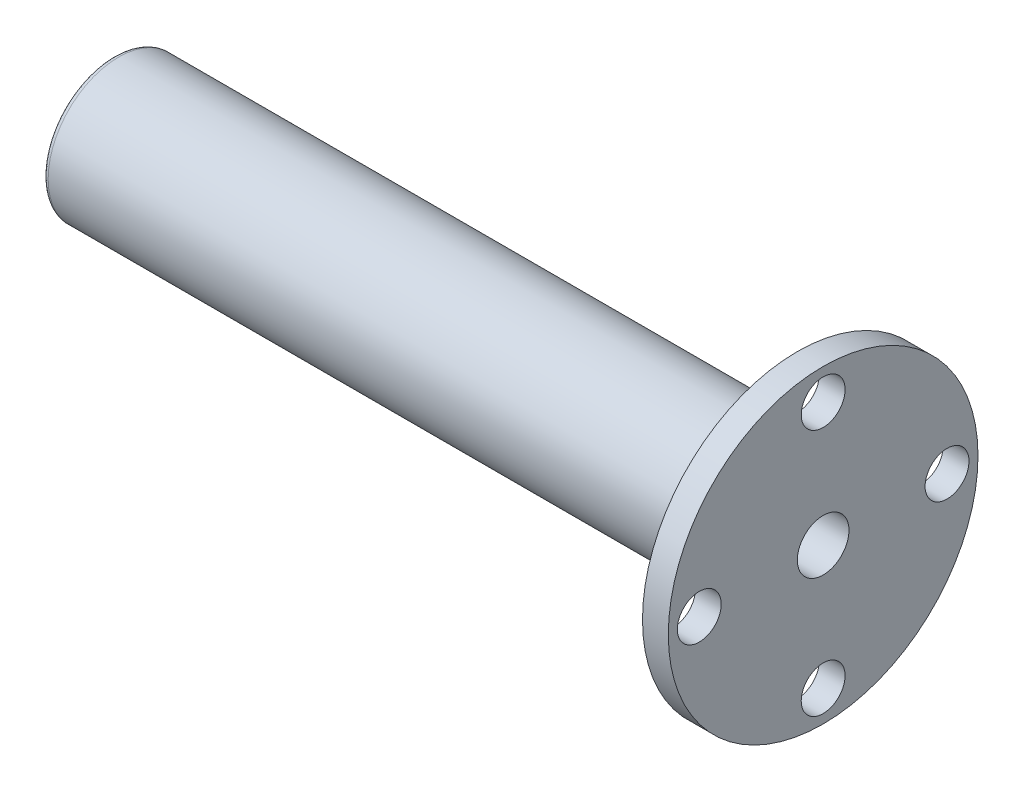
ISO-10303-21;
HEADER;
FILE_DESCRIPTION(('STEP AP214'),'2;1');
FILE_NAME('part.step','',(''),(''),'','','');
FILE_SCHEMA(('AUTOMOTIVE_DESIGN { 1 0 10303 214 1 1 1 1 }'));
ENDSEC;
DATA;
#1=APPLICATION_CONTEXT('core data for automotive mechanical design processes');
#2=APPLICATION_PROTOCOL_DEFINITION('international standard','automotive_design',2000,#1);
#3=PRODUCT_CONTEXT('',#1,'mechanical');
#4=PRODUCT('Part','Part','',(#3));
#5=PRODUCT_RELATED_PRODUCT_CATEGORY('part','',(#4));
#6=PRODUCT_DEFINITION_FORMATION('','',#4);
#7=PRODUCT_DEFINITION_CONTEXT('part definition',#1,'design');
#8=PRODUCT_DEFINITION('design','',#6,#7);
#9=PRODUCT_DEFINITION_SHAPE('','',#8);
#10=(LENGTH_UNIT() NAMED_UNIT(*) SI_UNIT(.MILLI.,.METRE.));
#11=(NAMED_UNIT(*) PLANE_ANGLE_UNIT() SI_UNIT($,.RADIAN.));
#12=(NAMED_UNIT(*) SI_UNIT($,.STERADIAN.) SOLID_ANGLE_UNIT());
#13=UNCERTAINTY_MEASURE_WITH_UNIT(LENGTH_MEASURE(1.E-05),#10,'distance_accuracy_value','');
#14=(GEOMETRIC_REPRESENTATION_CONTEXT(3) GLOBAL_UNCERTAINTY_ASSIGNED_CONTEXT((#13)) GLOBAL_UNIT_ASSIGNED_CONTEXT((#10,
#11,#12)) REPRESENTATION_CONTEXT('',''));
#15=CARTESIAN_POINT('',(0.,0.,0.));
#16=DIRECTION('',(0.,0.,1.));
#17=DIRECTION('',(1.,0.,0.));
#18=AXIS2_PLACEMENT_3D('',#15,#16,#17);
#19=CARTESIAN_POINT('',(-75.0544013863023,0.,0.));
#20=DIRECTION('',(-1.,0.,0.));
#21=DIRECTION('',(0.,0.,1.));
#22=AXIS2_PLACEMENT_3D('',#19,#20,#21);
#23=CYLINDRICAL_SURFACE('',#22,27.3);
#24=CARTESIAN_POINT('',(-73.0544013863023,0.,0.));
#25=DIRECTION('',(1.,0.,0.));
#26=DIRECTION('',(0.,0.,-1.));
#27=AXIS2_PLACEMENT_3D('',#24,#25,#26);
#28=CIRCLE('',#27,27.3);
#29=CARTESIAN_POINT('',(-73.0544013863023,0.,-27.3));
#30=VERTEX_POINT('',#29);
#31=EDGE_CURVE('E141',#30,#30,#28,.T.);
#32=ORIENTED_EDGE('',*,*,#31,.T.);
#33=EDGE_LOOP('',(#32));
#34=FACE_BOUND('',#33,.T.);
#35=CARTESIAN_POINT('',(189.945598613698,0.,0.));
#36=DIRECTION('',(-1.,0.,0.));
#37=DIRECTION('',(0.,0.,1.));
#38=AXIS2_PLACEMENT_3D('',#35,#36,#37);
#39=CIRCLE('',#38,27.3);
#40=CARTESIAN_POINT('',(189.945598613698,0.,27.3));
#41=VERTEX_POINT('',#40);
#42=EDGE_CURVE('E145',#41,#41,#39,.T.);
#43=ORIENTED_EDGE('',*,*,#42,.T.);
#44=EDGE_LOOP('',(#43));
#45=FACE_BOUND('',#44,.T.);
#46=CARTESIAN_POINT('',(59.4455986136977,-26.8382190169169,-5.));
#47=CARTESIAN_POINT('',(59.5848025792468,-26.8382177970626,-5.0000024378322));
#48=CARTESIAN_POINT('',(59.7239748181258,-26.8393041105939,-4.99418500173786));
#49=CARTESIAN_POINT('',(60.0013584689402,-26.8436148019896,-4.97096512411281));
#50=CARTESIAN_POINT('',(60.1395696988901,-26.8468395742379,-4.95356054562736));
#51=CARTESIAN_POINT('',(60.4140724517057,-26.8553365744693,-4.90728510211597));
#52=CARTESIAN_POINT('',(60.5503628135454,-26.8606099899744,-4.87840758643663));
#53=CARTESIAN_POINT('',(60.8200292035603,-26.8730517762385,-4.80939883176183));
#54=CARTESIAN_POINT('',(60.9534041409213,-26.8802208435533,-4.76926345574473));
#55=CARTESIAN_POINT('',(61.2160814409137,-26.8962347342738,-4.67810789799728));
#56=CARTESIAN_POINT('',(61.3453888483589,-26.9050773780515,-4.62710186319117));
#57=CARTESIAN_POINT('',(61.5992691709511,-26.9241948108778,-4.51453123003355));
#58=CARTESIAN_POINT('',(61.7238403195961,-26.9344701277352,-4.45296273844899));
#59=CARTESIAN_POINT('',(61.9672955193632,-26.9561543878969,-4.3197557301476));
#60=CARTESIAN_POINT('',(62.0861822162916,-26.9675627960473,-4.24812196064901));
#61=CARTESIAN_POINT('',(62.3175784784568,-26.9912025343333,-4.09523731612617));
#62=CARTESIAN_POINT('',(62.4300856444771,-27.0034341703361,-4.01398285796323));
#63=CARTESIAN_POINT('',(62.649047628831,-27.0285059319882,-3.84155337566043));
#64=CARTESIAN_POINT('',(62.7554283454366,-27.041351020036,-3.75028496084446));
#65=CARTESIAN_POINT('',(62.960184757601,-27.0671755912223,-3.55911637983718));
#66=CARTESIAN_POINT('',(63.0585574732193,-27.0801551223829,-3.45921302866405));
#67=CARTESIAN_POINT('',(63.2465542193582,-27.1058774666403,-3.251515121464));
#68=CARTESIAN_POINT('',(63.3361808828105,-27.118620350037,-3.14372295751016));
#69=CARTESIAN_POINT('',(63.506130357275,-27.143523120718,-2.92091107597553));
#70=CARTESIAN_POINT('',(63.5864497268785,-27.1556827913893,-2.80588870909218));
#71=CARTESIAN_POINT('',(63.7377006531204,-27.1791559271309,-2.56861610916354));
#72=CARTESIAN_POINT('',(63.8085635267716,-27.190462966435,-2.44632143542423));
#73=CARTESIAN_POINT('',(63.9397476939645,-27.2118207015395,-2.19604129430427));
#74=CARTESIAN_POINT('',(64.0000650420539,-27.2218709267228,-2.06805371937825));
#75=CARTESIAN_POINT('',(64.1096484828472,-27.2404191715908,-1.80737622923463));
#76=CARTESIAN_POINT('',(64.158919338296,-27.2489178599329,-1.67468836925199));
#77=CARTESIAN_POINT('',(64.2460768152893,-27.2641298445177,-1.40551130257619));
#78=CARTESIAN_POINT('',(64.283959289769,-27.2708424902731,-1.26902073085192));
#79=CARTESIAN_POINT('',(64.3792728229546,-27.2878553204478,-0.858480256945966));
#80=CARTESIAN_POINT('',(64.4197177864629,-27.2952662097628,-0.58014171600104));
#81=CARTESIAN_POINT('',(64.4534131431123,-27.3014278332886,-0.0206906631196302));
#82=CARTESIAN_POINT('',(64.4466673783722,-27.3001792725243,0.260421621126622));
#83=CARTESIAN_POINT('',(64.3866352501113,-27.2892469859458,0.814079337656359));
#84=CARTESIAN_POINT('',(64.3339061022822,-27.2796642553679,1.08668700393259));
#85=CARTESIAN_POINT('',(64.1842675251584,-27.2532494263621,1.61910777669911));
#86=CARTESIAN_POINT('',(64.0873565409742,-27.2364170727997,1.87892043253856));
#87=CARTESIAN_POINT('',(63.8515737010913,-27.1972257683891,2.38001482557585));
#88=CARTESIAN_POINT('',(63.7124775498109,-27.1748373951457,2.62118864176665));
#89=CARTESIAN_POINT('',(63.3964366583718,-27.1270122272265,3.0769801541829));
#90=CARTESIAN_POINT('',(63.2194882393959,-27.1015751363552,3.29159526599676));
#91=CARTESIAN_POINT('',(62.8296901644077,-27.0500332348173,3.69147867634295));
#92=CARTESIAN_POINT('',(62.6163529653486,-27.0239241003394,3.87627148503596));
#93=CARTESIAN_POINT('',(62.161461230043,-26.9743375326008,4.20752345744654));
#94=CARTESIAN_POINT('',(61.9199063175149,-26.9508601344425,4.353982109896));
#95=CARTESIAN_POINT('',(61.4148229031659,-26.9091897792839,4.60453470835017));
#96=CARTESIAN_POINT('',(61.1512606808253,-26.8910051306121,4.70856214932108));
#97=CARTESIAN_POINT('',(60.6099921159309,-26.8621084455278,4.87072702227421));
#98=CARTESIAN_POINT('',(60.332287300425,-26.851395604174,4.92886939756505));
#99=CARTESIAN_POINT('',(59.7748970351743,-26.838814006549,4.99692486604674));
#100=CARTESIAN_POINT('',(59.4952975907839,-26.8368202029872,5.00751993478122));
#101=CARTESIAN_POINT('',(58.938323925033,-26.841568144017,4.98200580314926));
#102=CARTESIAN_POINT('',(58.6609495995578,-26.8483094774593,4.94589880097734));
#103=CARTESIAN_POINT('',(58.1185252639528,-26.8696518378582,4.82859009613217));
#104=CARTESIAN_POINT('',(57.8533957707069,-26.8841909208478,4.74774363709599));
#105=CARTESIAN_POINT('',(57.3404464013099,-26.9194375301345,4.54362685365617));
#106=CARTESIAN_POINT('',(57.092627751108,-26.9401454927643,4.42035352825002));
#107=CARTESIAN_POINT('',(56.6183235652446,-26.9856826345608,4.13330426276875));
#108=CARTESIAN_POINT('',(56.3921037831267,-27.0105547923338,3.96909615428532));
#109=CARTESIAN_POINT('',(55.9701834501978,-27.0614958968079,3.60542259551839));
#110=CARTESIAN_POINT('',(55.7744855147894,-27.0875649458226,3.40595412691249));
#111=CARTESIAN_POINT('',(55.4166284280233,-27.1383631290945,2.97438518979902));
#112=CARTESIAN_POINT('',(55.2549271003077,-27.1630710252775,2.74190224029854));
#113=CARTESIAN_POINT('',(54.9728803487285,-27.2080088102487,2.25266256060173));
#114=CARTESIAN_POINT('',(54.8525333847993,-27.2282388657846,1.99590673479862));
#115=CARTESIAN_POINT('',(54.6572983915791,-27.2618521404341,1.46674887631915));
#116=CARTESIAN_POINT('',(54.582182347306,-27.2752696478342,1.19443303044741));
#117=CARTESIAN_POINT('',(54.478828811233,-27.2938842596134,0.640626063806048));
#118=CARTESIAN_POINT('',(54.4505866229477,-27.2990821875437,0.359135865134702));
#119=CARTESIAN_POINT('',(54.444036796155,-27.3002881567405,-0.0613149783921909));
#120=CARTESIAN_POINT('',(54.4476768842029,-27.2996184435085,-0.200214300905928));
#121=CARTESIAN_POINT('',(54.4664905104321,-27.2961792364161,-0.477189377645113));
#122=CARTESIAN_POINT('',(54.4816596972122,-27.2934105347732,-0.615265422786974));
#123=CARTESIAN_POINT('',(54.5234261676011,-27.2858455785434,-0.889660534548435));
#124=CARTESIAN_POINT('',(54.5500274643911,-27.2810486119544,-1.02597896684234));
#125=CARTESIAN_POINT('',(54.6144387631318,-27.2695636297487,-1.29581001173494));
#126=CARTESIAN_POINT('',(54.6522447421154,-27.2628762928967,-1.42932361299607));
#127=CARTESIAN_POINT('',(54.7387281585388,-27.247803965653,-1.69249280841468));
#128=CARTESIAN_POINT('',(54.7873917179064,-27.2394211436843,-1.82215309021539));
#129=CARTESIAN_POINT('',(54.8952386426316,-27.2211857546984,-2.07685912585402));
#130=CARTESIAN_POINT('',(54.9544182575974,-27.2113337118571,-2.20190650567714));
#131=CARTESIAN_POINT('',(55.0829091525584,-27.1904218734761,-2.4466404998651));
#132=CARTESIAN_POINT('',(55.1522244910863,-27.1793615945869,-2.5663249416115));
#133=CARTESIAN_POINT('',(55.3004563214873,-27.1563408420395,-2.79944068118229));
#134=CARTESIAN_POINT('',(55.3793694716733,-27.1443806822444,-2.9128741355496));
#135=CARTESIAN_POINT('',(55.5474511927181,-27.1197077442138,-3.13433263487515));
#136=CARTESIAN_POINT('',(55.6367484362861,-27.1069867442782,-3.24225912662751));
#137=CARTESIAN_POINT('',(55.8240298129179,-27.0813065134862,-3.45018988779972));
#138=CARTESIAN_POINT('',(55.9220108561996,-27.0683473686548,-3.55019695123935));
#139=CARTESIAN_POINT('',(56.1260811381645,-27.0425396064452,-3.74171025993284));
#140=CARTESIAN_POINT('',(56.2321751931972,-27.0296910598391,-3.83321138303588));
#141=CARTESIAN_POINT('',(56.4516602119708,-27.0044772116343,-4.00698371724213));
#142=CARTESIAN_POINT('',(56.565048475024,-26.9921117338735,-4.08925831387571));
#143=CARTESIAN_POINT('',(56.7994596020698,-26.9680985317082,-4.24475084512979));
#144=CARTESIAN_POINT('',(56.9205428892281,-26.9564584201594,-4.3178789095735));
#145=CARTESIAN_POINT('',(57.168506019313,-26.9343629548725,-4.453630169573));
#146=CARTESIAN_POINT('',(57.2953837058715,-26.9239071653535,-4.51625723315873));
#147=CARTESIAN_POINT('',(57.5540059220525,-26.9044887670167,-4.63053408090751));
#148=CARTESIAN_POINT('',(57.6857471927738,-26.8955251797473,-4.68219106443534));
#149=CARTESIAN_POINT('',(57.9531868530873,-26.8793501414454,-4.77417103706977));
#150=CARTESIAN_POINT('',(58.0888844255958,-26.8721383314544,-4.81449634842751));
#151=CARTESIAN_POINT('',(58.4250728018721,-26.8568810423614,-4.8990384566312));
#152=CARTESIAN_POINT('',(58.6272599643177,-26.8499190109916,-4.93685081446956));
#153=CARTESIAN_POINT('',(59.0348540207047,-26.8405889554909,-4.98732947326638));
#154=CARTESIAN_POINT('',(59.2402608338804,-26.8382208163066,-4.99999640398857));
#155=CARTESIAN_POINT('',(59.4455986136977,-26.8382190169169,-5.));
#156=B_SPLINE_CURVE_WITH_KNOTS('',3,(#46,#47,#48,#49,#50,#51,#52,#53,#54,#55,#56,#57,#58,#59,
#60,#61,#62,#63,#64,#65,#66,#67,#68,#69,#70,#71,#72,#73,#74,#75,#76,#77,#78,#79,#80,#81,#82,#83,
#84,#85,#86,#87,#88,#89,#90,#91,#92,#93,#94,#95,#96,#97,#98,#99,#100,#101,#102,#103,#104,#105,
#106,#107,#108,#109,#110,#111,#112,#113,#114,#115,#116,#117,#118,#119,#120,#121,#122,#123,#124,
#125,#126,#127,#128,#129,#130,#131,#132,#133,#134,#135,#136,#137,#138,#139,#140,#141,#142,#143,
#144,#145,#146,#147,#148,#149,#150,#151,#152,#153,#154,#155),.UNSPECIFIED.,.T.,.F.,(4,2,2,2,2,2,
2,2,2,2,2,2,2,2,2,2,2,2,2,2,2,2,2,2,2,2,2,2,2,2,2,2,2,2,2,2,2,2,2,2,2,2,2,2,2,2,2,2,2,2,2,2,2,2,
4),(0.,0.417431625696767,0.834940257411033,1.2526912652538,1.67059598918417,2.08796014286286,
2.50547846529665,2.92280052501638,3.34027850439555,3.7620478587931,4.18397345147147,
4.60577163229757,5.02772528035505,5.45259374794326,5.8776208351848,6.30246431616432,
6.72746231649552,7.56709876669033,8.40666685715577,9.23620045100729,10.0657632408528,
10.8998164729607,11.7339508025745,12.580293443605,13.4266473718527,14.2743227915773,
15.121906876716,15.9572943026427,16.7926424096011,17.6214508669065,18.4503179608219,
19.2883367191858,20.1264272475694,20.9751684235411,21.8238779883657,22.6682724763693,
23.5125823558914,23.9290220007766,24.3453045478092,24.7617333481339,25.1780128132121,
25.5937632108048,26.0093656338123,26.4251349298065,26.8407598788519,27.2622327213363,
27.6835561970851,28.1051317659417,28.5265521345213,28.951833026964,29.3769569219657,
29.8018009515968,30.2265578524065,30.8423206986454,31.458068122995),.UNSPECIFIED.);
#157=CARTESIAN_POINT('',(59.4455986136977,-26.8382190169169,-5.));
#158=VERTEX_POINT('',#157);
#159=EDGE_CURVE('E76',#158,#158,#156,.T.);
#160=ORIENTED_EDGE('',*,*,#159,.F.);
#161=EDGE_LOOP('',(#160));
#162=FACE_BOUND('',#161,.T.);
#163=ADVANCED_FACE('F38',(#34,#45,#162),#23,.T.);
#164=CARTESIAN_POINT('',(61.3455986136977,0.,0.));
#165=DIRECTION('',(1.,0.,0.));
#166=DIRECTION('',(0.,0.,-1.));
#167=AXIS2_PLACEMENT_3D('',#164,#165,#166);
#168=CYLINDRICAL_SURFACE('',#167,5.);
#169=CARTESIAN_POINT('',(174.945598613698,0.,0.));
#170=DIRECTION('',(1.,0.,0.));
#171=DIRECTION('',(0.,0.,-1.));
#172=AXIS2_PLACEMENT_3D('',#169,#170,#171);
#173=CIRCLE('',#172,5.);
#174=CARTESIAN_POINT('',(174.945598613698,0.,-5.));
#175=VERTEX_POINT('',#174);
#176=EDGE_CURVE('E87',#175,#175,#173,.T.);
#177=ORIENTED_EDGE('',*,*,#176,.T.);
#178=EDGE_LOOP('',(#177));
#179=FACE_BOUND('',#178,.T.);
#180=CARTESIAN_POINT('',(59.4455986136977,0.,0.));
#181=DIRECTION('',(0.707106781186547,-0.707106781186547,0.));
#182=DIRECTION('',(0.707106781186547,0.707106781186547,0.));
#183=AXIS2_PLACEMENT_3D('',#180,#181,#182);
#184=ELLIPSE('',#183,7.07106781186547,5.);
#185=CARTESIAN_POINT('',(61.3455986136977,1.90000000000001,-4.62493243193887));
#186=VERTEX_POINT('',#185);
#187=CARTESIAN_POINT('',(64.4455986136977,5.,0.));
#188=VERTEX_POINT('',#187);
#189=EDGE_CURVE('E67',#186,#188,#184,.T.);
#190=ORIENTED_EDGE('',*,*,#189,.F.);
#191=CARTESIAN_POINT('',(61.3455986136977,0.,0.));
#192=DIRECTION('',(1.,0.,0.));
#193=DIRECTION('',(0.,0.,-1.));
#194=AXIS2_PLACEMENT_3D('',#191,#192,#193);
#195=CIRCLE('',#194,5.);
#196=CARTESIAN_POINT('',(61.3455986136977,-1.90000000000001,-4.62493243193887));
#197=VERTEX_POINT('',#196);
#198=EDGE_CURVE('E88',#197,#186,#195,.T.);
#199=ORIENTED_EDGE('',*,*,#198,.F.);
#200=CARTESIAN_POINT('',(59.4455986136977,0.,0.));
#201=DIRECTION('',(0.707106781186547,0.707106781186547,0.));
#202=DIRECTION('',(0.707106781186547,-0.707106781186547,0.));
#203=AXIS2_PLACEMENT_3D('',#200,#201,#202);
#204=ELLIPSE('',#203,7.07106781186547,5.);
#205=CARTESIAN_POINT('',(61.3455986136977,-1.90000000000001,4.62493243193887));
#206=VERTEX_POINT('',#205);
#207=EDGE_CURVE('E53',#206,#197,#204,.T.);
#208=ORIENTED_EDGE('',*,*,#207,.F.);
#209=CARTESIAN_POINT('',(61.3455986136977,1.90000000000001,4.62493243193887));
#210=VERTEX_POINT('',#209);
#211=EDGE_CURVE('E178',#210,#206,#195,.T.);
#212=ORIENTED_EDGE('',*,*,#211,.F.);
#213=EDGE_CURVE('E59',#188,#210,#184,.T.);
#214=ORIENTED_EDGE('',*,*,#213,.F.);
#215=EDGE_LOOP('',(#190,#199,#208,#212,#214));
#216=FACE_BOUND('',#215,.T.);
#217=ADVANCED_FACE('F102',(#179,#216),#168,.F.);
#218=CARTESIAN_POINT('',(61.3455986136977,0.,0.));
#219=DIRECTION('',(1.,0.,0.));
#220=DIRECTION('',(0.,0.,-1.));
#221=AXIS2_PLACEMENT_3D('',#218,#219,#220);
#222=PLANE('',#221);
#223=ORIENTED_EDGE('',*,*,#211,.T.);
#224=DIRECTION('',(0.,-1.,0.));
#225=VECTOR('',#224,1.);
#226=CARTESIAN_POINT('',(61.3455986136977,5.,4.62493243193887));
#227=LINE('',#226,#225);
#228=EDGE_CURVE('E11',#206,#210,#227,.F.);
#229=ORIENTED_EDGE('',*,*,#228,.T.);
#230=EDGE_LOOP('',(#223,#229));
#231=FACE_BOUND('',#230,.T.);
#232=ADVANCED_FACE('F98',(#231),#222,.T.);
#233=ORIENTED_EDGE('',*,*,#198,.T.);
#234=DIRECTION('',(0.,-1.,0.));
#235=VECTOR('',#234,1.);
#236=CARTESIAN_POINT('',(61.3455986136977,5.,-4.62493243193887));
#237=LINE('',#236,#235);
#238=EDGE_CURVE('E46',#186,#197,#237,.T.);
#239=ORIENTED_EDGE('',*,*,#238,.T.);
#240=EDGE_LOOP('',(#233,#239));
#241=FACE_BOUND('',#240,.T.);
#242=ADVANCED_FACE('F101',(#241),#222,.T.);
#243=CARTESIAN_POINT('',(199.945598613698,0.,0.));
#244=DIRECTION('',(-1.,0.,0.));
#245=DIRECTION('',(0.,0.,1.));
#246=AXIS2_PLACEMENT_3D('',#243,#244,#245);
#247=PLANE('',#246);
#248=CARTESIAN_POINT('',(199.945598613698,-48.,0.));
#249=DIRECTION('',(-1.,0.,0.));
#250=DIRECTION('',(0.,0.,1.));
#251=AXIS2_PLACEMENT_3D('',#248,#249,#250);
#252=CIRCLE('',#251,8.49999999999999);
#253=CARTESIAN_POINT('',(199.945598613698,-48.,8.49999999999999));
#254=VERTEX_POINT('',#253);
#255=EDGE_CURVE('E168',#254,#254,#252,.T.);
#256=ORIENTED_EDGE('',*,*,#255,.T.);
#257=EDGE_LOOP('',(#256));
#258=FACE_BOUND('',#257,.T.);
#259=CARTESIAN_POINT('',(199.945598613698,48.,0.));
#260=DIRECTION('',(1.,0.,0.));
#261=DIRECTION('',(0.,0.,-1.));
#262=AXIS2_PLACEMENT_3D('',#259,#260,#261);
#263=CIRCLE('',#262,8.5);
#264=CARTESIAN_POINT('',(199.945598613698,48.,-8.5));
#265=VERTEX_POINT('',#264);
#266=EDGE_CURVE('E186',#265,#265,#263,.T.);
#267=ORIENTED_EDGE('',*,*,#266,.F.);
#268=EDGE_LOOP('',(#267));
#269=FACE_BOUND('',#268,.T.);
#270=CARTESIAN_POINT('',(199.945598613698,0.,0.));
#271=DIRECTION('',(-1.,0.,0.));
#272=DIRECTION('',(0.,0.,1.));
#273=AXIS2_PLACEMENT_3D('',#270,#271,#272);
#274=CIRCLE('',#273,60.);
#275=CARTESIAN_POINT('',(199.945598613698,0.,60.));
#276=VERTEX_POINT('',#275);
#277=EDGE_CURVE('E152',#276,#276,#274,.T.);
#278=ORIENTED_EDGE('',*,*,#277,.F.);
#279=EDGE_LOOP('',(#278));
#280=FACE_BOUND('',#279,.T.);
#281=CARTESIAN_POINT('',(199.945598613698,0.,-48.));
#282=DIRECTION('',(-1.,0.,0.));
#283=DIRECTION('',(0.,0.,1.));
#284=AXIS2_PLACEMENT_3D('',#281,#282,#283);
#285=CIRCLE('',#284,8.5);
#286=CARTESIAN_POINT('',(199.945598613698,0.,-39.5));
#287=VERTEX_POINT('',#286);
#288=EDGE_CURVE('E185',#287,#287,#285,.T.);
#289=ORIENTED_EDGE('',*,*,#288,.T.);
#290=EDGE_LOOP('',(#289));
#291=FACE_BOUND('',#290,.T.);
#292=CARTESIAN_POINT('',(199.945598613698,0.,48.));
#293=DIRECTION('',(1.,0.,0.));
#294=DIRECTION('',(0.,0.,-1.));
#295=AXIS2_PLACEMENT_3D('',#292,#293,#294);
#296=CIRCLE('',#295,8.5);
#297=CARTESIAN_POINT('',(199.945598613698,0.,39.5));
#298=VERTEX_POINT('',#297);
#299=EDGE_CURVE('E158',#298,#298,#296,.T.);
#300=ORIENTED_EDGE('',*,*,#299,.F.);
#301=EDGE_LOOP('',(#300));
#302=FACE_BOUND('',#301,.T.);
#303=CARTESIAN_POINT('',(199.945598613698,0.,0.));
#304=DIRECTION('',(1.,0.,0.));
#305=DIRECTION('',(0.,0.,-1.));
#306=AXIS2_PLACEMENT_3D('',#303,#304,#305);
#307=CIRCLE('',#306,10.);
#308=CARTESIAN_POINT('',(199.945598613698,0.,-10.));
#309=VERTEX_POINT('',#308);
#310=EDGE_CURVE('E189',#309,#309,#307,.T.);
#311=ORIENTED_EDGE('',*,*,#310,.F.);
#312=EDGE_LOOP('',(#311));
#313=FACE_BOUND('',#312,.T.);
#314=ADVANCED_FACE('F198',(#258,#269,#280,#291,#302,#313),#247,.F.);
#315=CARTESIAN_POINT('',(189.945598613698,60.,0.));
#316=DIRECTION('',(1.,0.,0.));
#317=DIRECTION('',(0.,0.,-1.));
#318=AXIS2_PLACEMENT_3D('',#315,#316,#317);
#319=PLANE('',#318);
#320=CARTESIAN_POINT('',(189.945598613698,-48.,0.));
#321=DIRECTION('',(1.,0.,0.));
#322=DIRECTION('',(0.,0.,-1.));
#323=AXIS2_PLACEMENT_3D('',#320,#321,#322);
#324=CIRCLE('',#323,8.49999999999999);
#325=CARTESIAN_POINT('',(189.945598613698,-48.,-8.5));
#326=VERTEX_POINT('',#325);
#327=EDGE_CURVE('E149',#326,#326,#324,.F.);
#328=ORIENTED_EDGE('',*,*,#327,.F.);
#329=EDGE_LOOP('',(#328));
#330=FACE_BOUND('',#329,.T.);
#331=CARTESIAN_POINT('',(189.945598613698,0.,48.));
#332=DIRECTION('',(1.,0.,0.));
#333=DIRECTION('',(0.,0.,-1.));
#334=AXIS2_PLACEMENT_3D('',#331,#332,#333);
#335=CIRCLE('',#334,8.5);
#336=CARTESIAN_POINT('',(189.945598613698,0.,39.5));
#337=VERTEX_POINT('',#336);
#338=EDGE_CURVE('E167',#337,#337,#335,.T.);
#339=ORIENTED_EDGE('',*,*,#338,.T.);
#340=EDGE_LOOP('',(#339));
#341=FACE_BOUND('',#340,.T.);
#342=CARTESIAN_POINT('',(189.945598613698,0.,-48.));
#343=DIRECTION('',(1.,0.,0.));
#344=DIRECTION('',(0.,0.,-1.));
#345=AXIS2_PLACEMENT_3D('',#342,#343,#344);
#346=CIRCLE('',#345,8.5);
#347=CARTESIAN_POINT('',(189.945598613698,0.,-56.5));
#348=VERTEX_POINT('',#347);
#349=EDGE_CURVE('E164',#348,#348,#346,.F.);
#350=ORIENTED_EDGE('',*,*,#349,.F.);
#351=EDGE_LOOP('',(#350));
#352=FACE_BOUND('',#351,.T.);
#353=ORIENTED_EDGE('',*,*,#42,.F.);
#354=EDGE_LOOP('',(#353));
#355=FACE_BOUND('',#354,.T.);
#356=CARTESIAN_POINT('',(189.945598613698,0.,0.));
#357=DIRECTION('',(-1.,0.,0.));
#358=DIRECTION('',(0.,0.,1.));
#359=AXIS2_PLACEMENT_3D('',#356,#357,#358);
#360=CIRCLE('',#359,60.);
#361=CARTESIAN_POINT('',(189.945598613698,0.,60.));
#362=VERTEX_POINT('',#361);
#363=EDGE_CURVE('E148',#362,#362,#360,.T.);
#364=ORIENTED_EDGE('',*,*,#363,.T.);
#365=EDGE_LOOP('',(#364));
#366=FACE_BOUND('',#365,.T.);
#367=CARTESIAN_POINT('',(189.945598613698,48.,0.));
#368=DIRECTION('',(1.,0.,0.));
#369=DIRECTION('',(0.,0.,-1.));
#370=AXIS2_PLACEMENT_3D('',#367,#368,#369);
#371=CIRCLE('',#370,8.5);
#372=CARTESIAN_POINT('',(189.945598613698,48.,-8.5));
#373=VERTEX_POINT('',#372);
#374=EDGE_CURVE('E155',#373,#373,#371,.T.);
#375=ORIENTED_EDGE('',*,*,#374,.T.);
#376=EDGE_LOOP('',(#375));
#377=FACE_BOUND('',#376,.T.);
#378=ADVANCED_FACE('F201',(#330,#341,#352,#355,#366,#377),#319,.F.);
#379=CARTESIAN_POINT('',(-75.0544013863023,27.3,0.));
#380=DIRECTION('',(1.,0.,0.));
#381=DIRECTION('',(0.,0.,-1.));
#382=AXIS2_PLACEMENT_3D('',#379,#380,#381);
#383=PLANE('',#382);
#384=CARTESIAN_POINT('',(-75.0544013863023,0.,0.));
#385=DIRECTION('',(1.,0.,0.));
#386=DIRECTION('',(0.,0.,-1.));
#387=AXIS2_PLACEMENT_3D('',#384,#385,#386);
#388=CIRCLE('',#387,25.3);
#389=CARTESIAN_POINT('',(-75.0544013863023,0.,-25.3));
#390=VERTEX_POINT('',#389);
#391=EDGE_CURVE('E163',#390,#390,#388,.F.);
#392=ORIENTED_EDGE('',*,*,#391,.T.);
#393=EDGE_LOOP('',(#392));
#394=FACE_BOUND('',#393,.T.);
#395=ADVANCED_FACE('F210',(#394),#383,.F.);
#396=CARTESIAN_POINT('',(-75.0544013863023,0.,0.));
#397=DIRECTION('',(-1.,0.,0.));
#398=DIRECTION('',(0.,0.,1.));
#399=AXIS2_PLACEMENT_3D('',#396,#397,#398);
#400=CYLINDRICAL_SURFACE('',#399,60.);
#401=ORIENTED_EDGE('',*,*,#363,.F.);
#402=EDGE_LOOP('',(#401));
#403=FACE_BOUND('',#402,.T.);
#404=ORIENTED_EDGE('',*,*,#277,.T.);
#405=EDGE_LOOP('',(#404));
#406=FACE_BOUND('',#405,.T.);
#407=ADVANCED_FACE('F126',(#403,#406),#400,.T.);
#408=CARTESIAN_POINT('',(174.945598613698,0.,-48.));
#409=DIRECTION('',(1.,0.,0.));
#410=DIRECTION('',(0.,0.,-1.));
#411=AXIS2_PLACEMENT_3D('',#408,#409,#410);
#412=CYLINDRICAL_SURFACE('',#411,8.5);
#413=ORIENTED_EDGE('',*,*,#288,.F.);
#414=EDGE_LOOP('',(#413));
#415=FACE_BOUND('',#414,.T.);
#416=ORIENTED_EDGE('',*,*,#349,.T.);
#417=EDGE_LOOP('',(#416));
#418=FACE_BOUND('',#417,.T.);
#419=ADVANCED_FACE('F124',(#415,#418),#412,.F.);
#420=CARTESIAN_POINT('',(174.945598613698,0.,48.));
#421=DIRECTION('',(1.,0.,0.));
#422=DIRECTION('',(0.,0.,-1.));
#423=AXIS2_PLACEMENT_3D('',#420,#421,#422);
#424=CYLINDRICAL_SURFACE('',#423,8.5);
#425=ORIENTED_EDGE('',*,*,#299,.T.);
#426=EDGE_LOOP('',(#425));
#427=FACE_BOUND('',#426,.T.);
#428=ORIENTED_EDGE('',*,*,#338,.F.);
#429=EDGE_LOOP('',(#428));
#430=FACE_BOUND('',#429,.T.);
#431=ADVANCED_FACE('F115',(#427,#430),#424,.F.);
#432=CARTESIAN_POINT('',(174.945598613698,48.,0.));
#433=DIRECTION('',(1.,0.,0.));
#434=DIRECTION('',(0.,0.,-1.));
#435=AXIS2_PLACEMENT_3D('',#432,#433,#434);
#436=CYLINDRICAL_SURFACE('',#435,8.5);
#437=ORIENTED_EDGE('',*,*,#266,.T.);
#438=EDGE_LOOP('',(#437));
#439=FACE_BOUND('',#438,.T.);
#440=ORIENTED_EDGE('',*,*,#374,.F.);
#441=EDGE_LOOP('',(#440));
#442=FACE_BOUND('',#441,.T.);
#443=ADVANCED_FACE('F111',(#439,#442),#436,.F.);
#444=CARTESIAN_POINT('',(174.945598613698,-48.,0.));
#445=DIRECTION('',(1.,0.,0.));
#446=DIRECTION('',(0.,0.,-1.));
#447=AXIS2_PLACEMENT_3D('',#444,#445,#446);
#448=CYLINDRICAL_SURFACE('',#447,8.49999999999999);
#449=ORIENTED_EDGE('',*,*,#255,.F.);
#450=EDGE_LOOP('',(#449));
#451=FACE_BOUND('',#450,.T.);
#452=ORIENTED_EDGE('',*,*,#327,.T.);
#453=EDGE_LOOP('',(#452));
#454=FACE_BOUND('',#453,.T.);
#455=ADVANCED_FACE('F107',(#451,#454),#448,.F.);
#456=CARTESIAN_POINT('',(174.945598613698,0.,0.));
#457=DIRECTION('',(1.,0.,0.));
#458=DIRECTION('',(0.,0.,-1.));
#459=AXIS2_PLACEMENT_3D('',#456,#457,#458);
#460=CYLINDRICAL_SURFACE('',#459,10.);
#461=CARTESIAN_POINT('',(174.945598613698,0.,0.));
#462=DIRECTION('',(1.,0.,0.));
#463=DIRECTION('',(0.,0.,-1.));
#464=AXIS2_PLACEMENT_3D('',#461,#462,#463);
#465=CIRCLE('',#464,10.);
#466=CARTESIAN_POINT('',(174.945598613698,0.,-10.));
#467=VERTEX_POINT('',#466);
#468=EDGE_CURVE('E179',#467,#467,#465,.T.);
#469=ORIENTED_EDGE('',*,*,#468,.F.);
#470=EDGE_LOOP('',(#469));
#471=FACE_BOUND('',#470,.T.);
#472=ORIENTED_EDGE('',*,*,#310,.T.);
#473=EDGE_LOOP('',(#472));
#474=FACE_BOUND('',#473,.T.);
#475=ADVANCED_FACE('F110',(#471,#474),#460,.F.);
#476=CARTESIAN_POINT('',(174.945598613698,0.,0.));
#477=DIRECTION('',(1.,0.,0.));
#478=DIRECTION('',(0.,0.,-1.));
#479=AXIS2_PLACEMENT_3D('',#476,#477,#478);
#480=PLANE('',#479);
#481=ORIENTED_EDGE('',*,*,#176,.F.);
#482=EDGE_LOOP('',(#481));
#483=FACE_BOUND('',#482,.T.);
#484=ORIENTED_EDGE('',*,*,#468,.T.);
#485=EDGE_LOOP('',(#484));
#486=FACE_BOUND('',#485,.T.);
#487=ADVANCED_FACE('F119',(#483,#486),#480,.T.);
#488=CARTESIAN_POINT('',(-73.0544013863023,0.,0.));
#489=DIRECTION('',(1.,0.,0.));
#490=DIRECTION('',(0.,0.,-1.));
#491=AXIS2_PLACEMENT_3D('',#488,#489,#490);
#492=TOROIDAL_SURFACE('',#491,25.3,2.);
#493=ORIENTED_EDGE('',*,*,#31,.F.);
#494=EDGE_LOOP('',(#493));
#495=FACE_BOUND('',#494,.T.);
#496=ORIENTED_EDGE('',*,*,#391,.F.);
#497=EDGE_LOOP('',(#496));
#498=FACE_BOUND('',#497,.T.);
#499=ADVANCED_FACE('F40',(#495,#498),#492,.T.);
#500=CARTESIAN_POINT('',(59.4455986136977,5.,0.));
#501=DIRECTION('',(0.,-1.,0.));
#502=DIRECTION('',(0.,0.,-1.));
#503=AXIS2_PLACEMENT_3D('',#500,#501,#502);
#504=CYLINDRICAL_SURFACE('',#503,5.);
#505=ORIENTED_EDGE('',*,*,#213,.T.);
#506=ORIENTED_EDGE('',*,*,#228,.F.);
#507=ORIENTED_EDGE('',*,*,#207,.T.);
#508=ORIENTED_EDGE('',*,*,#238,.F.);
#509=ORIENTED_EDGE('',*,*,#189,.T.);
#510=CARTESIAN_POINT('',(59.4455986136977,5.,0.));
#511=DIRECTION('',(0.,1.,0.));
#512=DIRECTION('',(0.,0.,1.));
#513=AXIS2_PLACEMENT_3D('',#510,#511,#512);
#514=CIRCLE('',#513,5.);
#515=EDGE_CURVE('E71',#188,#188,#514,.T.);
#516=ORIENTED_EDGE('',*,*,#515,.T.);
#517=EDGE_LOOP('',(#505,#506,#507,#508,#509,#516));
#518=FACE_BOUND('',#517,.T.);
#519=ORIENTED_EDGE('',*,*,#159,.T.);
#520=EDGE_LOOP('',(#519));
#521=FACE_BOUND('',#520,.T.);
#522=ADVANCED_FACE('F68',(#518,#521),#504,.F.);
#523=CARTESIAN_POINT('',(59.4455986136977,5.,0.));
#524=DIRECTION('',(0.,1.,0.));
#525=DIRECTION('',(0.,0.,1.));
#526=AXIS2_PLACEMENT_3D('',#523,#524,#525);
#527=PLANE('',#526);
#528=ORIENTED_EDGE('',*,*,#515,.F.);
#529=EDGE_LOOP('',(#528));
#530=FACE_BOUND('',#529,.T.);
#531=ADVANCED_FACE('F97',(#530),#527,.F.);
#532=CLOSED_SHELL('',(#163,#217,#232,#242,#314,#378,#395,#407,#419,#431,#443,#455,#475,#487,
#499,#522,#531));
#533=MANIFOLD_SOLID_BREP('B2',#532);
#534=ADVANCED_BREP_SHAPE_REPRESENTATION('',(#18,#533),#14);
#535=SHAPE_DEFINITION_REPRESENTATION(#9,#534);
ENDSEC;
END-ISO-10303-21;
